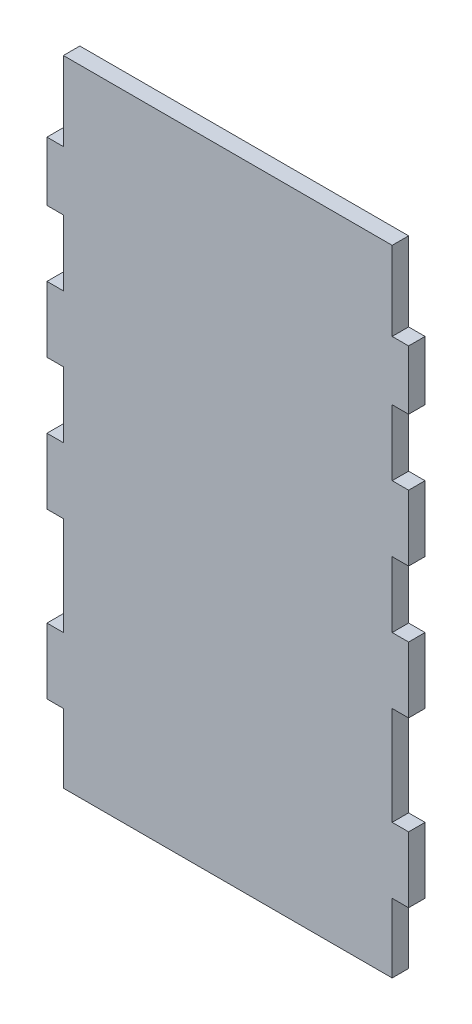
ISO-10303-21;
HEADER;
FILE_DESCRIPTION(('STEP AP214'),'2;1');
FILE_NAME('part.step','',(''),(''),'','','');
FILE_SCHEMA(('AUTOMOTIVE_DESIGN { 1 0 10303 214 1 1 1 1 }'));
ENDSEC;
DATA;
#1=APPLICATION_CONTEXT('core data for automotive mechanical design processes');
#2=APPLICATION_PROTOCOL_DEFINITION('international standard','automotive_design',2000,#1);
#3=PRODUCT_CONTEXT('',#1,'mechanical');
#4=PRODUCT('Part','Part','',(#3));
#5=PRODUCT_RELATED_PRODUCT_CATEGORY('part','',(#4));
#6=PRODUCT_DEFINITION_FORMATION('','',#4);
#7=PRODUCT_DEFINITION_CONTEXT('part definition',#1,'design');
#8=PRODUCT_DEFINITION('design','',#6,#7);
#9=PRODUCT_DEFINITION_SHAPE('','',#8);
#10=(LENGTH_UNIT() NAMED_UNIT(*) SI_UNIT(.MILLI.,.METRE.));
#11=(NAMED_UNIT(*) PLANE_ANGLE_UNIT() SI_UNIT($,.RADIAN.));
#12=(NAMED_UNIT(*) SI_UNIT($,.STERADIAN.) SOLID_ANGLE_UNIT());
#13=UNCERTAINTY_MEASURE_WITH_UNIT(LENGTH_MEASURE(1.E-05),#10,'distance_accuracy_value','');
#14=(GEOMETRIC_REPRESENTATION_CONTEXT(3) GLOBAL_UNCERTAINTY_ASSIGNED_CONTEXT((#13)) GLOBAL_UNIT_ASSIGNED_CONTEXT((#10,
#11,#12)) REPRESENTATION_CONTEXT('',''));
#15=CARTESIAN_POINT('',(0.,0.,0.));
#16=DIRECTION('',(0.,0.,1.));
#17=DIRECTION('',(1.,0.,0.));
#18=AXIS2_PLACEMENT_3D('',#15,#16,#17);
#19=CARTESIAN_POINT('',(-133.35,6.34999999999993,6.35));
#20=DIRECTION('',(1.,0.,0.));
#21=DIRECTION('',(0.,0.,-1.));
#22=AXIS2_PLACEMENT_3D('',#19,#20,#21);
#23=PLANE('',#22);
#24=DIRECTION('',(0.,-1.,0.));
#25=VECTOR('',#24,1.);
#26=CARTESIAN_POINT('',(-133.35,6.34999999999993,0.));
#27=LINE('',#26,#25);
#28=CARTESIAN_POINT('',(-133.35,58.42,0.));
#29=VERTEX_POINT('',#28);
#30=CARTESIAN_POINT('',(-133.35,33.02,0.));
#31=VERTEX_POINT('',#30);
#32=EDGE_CURVE('E312',#29,#31,#27,.T.);
#33=ORIENTED_EDGE('',*,*,#32,.T.);
#34=DIRECTION('',(0.,0.,-1.));
#35=VECTOR('',#34,1.);
#36=CARTESIAN_POINT('',(-133.35,33.02,6.35));
#37=LINE('',#36,#35);
#38=CARTESIAN_POINT('',(-133.35,33.02,6.35));
#39=VERTEX_POINT('',#38);
#40=EDGE_CURVE('E948',#39,#31,#37,.T.);
#41=ORIENTED_EDGE('',*,*,#40,.F.);
#42=DIRECTION('',(0.,-1.,0.));
#43=VECTOR('',#42,1.);
#44=CARTESIAN_POINT('',(-133.35,6.34999999999993,6.35));
#45=LINE('',#44,#43);
#46=CARTESIAN_POINT('',(-133.35,58.42,6.35));
#47=VERTEX_POINT('',#46);
#48=EDGE_CURVE('E300',#47,#39,#45,.T.);
#49=ORIENTED_EDGE('',*,*,#48,.F.);
#50=DIRECTION('',(0.,0.,-1.));
#51=VECTOR('',#50,1.);
#52=CARTESIAN_POINT('',(-133.35,58.42,6.35));
#53=LINE('',#52,#51);
#54=EDGE_CURVE('E366',#47,#29,#53,.T.);
#55=ORIENTED_EDGE('',*,*,#54,.T.);
#56=EDGE_LOOP('',(#33,#41,#49,#55));
#57=FACE_BOUND('',#56,.T.);
#58=ADVANCED_FACE('F37',(#57),#23,.F.);
#59=CARTESIAN_POINT('',(-133.35,121.92,0.));
#60=VERTEX_POINT('',#59);
#61=CARTESIAN_POINT('',(-133.35,96.52,0.));
#62=VERTEX_POINT('',#61);
#63=EDGE_CURVE('E314',#60,#62,#27,.T.);
#64=ORIENTED_EDGE('',*,*,#63,.T.);
#65=DIRECTION('',(0.,0.,-1.));
#66=VECTOR('',#65,1.);
#67=CARTESIAN_POINT('',(-133.35,96.52,6.35));
#68=LINE('',#67,#66);
#69=CARTESIAN_POINT('',(-133.35,96.52,6.35));
#70=VERTEX_POINT('',#69);
#71=EDGE_CURVE('E339',#70,#62,#68,.T.);
#72=ORIENTED_EDGE('',*,*,#71,.F.);
#73=CARTESIAN_POINT('',(-133.35,121.92,6.35));
#74=VERTEX_POINT('',#73);
#75=EDGE_CURVE('E303',#74,#70,#45,.T.);
#76=ORIENTED_EDGE('',*,*,#75,.F.);
#77=DIRECTION('',(0.,0.,-1.));
#78=VECTOR('',#77,1.);
#79=CARTESIAN_POINT('',(-133.35,121.92,6.35));
#80=LINE('',#79,#78);
#81=EDGE_CURVE('E341',#74,#60,#80,.T.);
#82=ORIENTED_EDGE('',*,*,#81,.T.);
#83=EDGE_LOOP('',(#64,#72,#76,#82));
#84=FACE_BOUND('',#83,.T.);
#85=ADVANCED_FACE('F337',(#84),#23,.F.);
#86=CARTESIAN_POINT('',(-133.35,172.72,0.));
#87=VERTEX_POINT('',#86);
#88=CARTESIAN_POINT('',(-133.35,147.32,0.));
#89=VERTEX_POINT('',#88);
#90=EDGE_CURVE('E322',#87,#89,#27,.T.);
#91=ORIENTED_EDGE('',*,*,#90,.T.);
#92=DIRECTION('',(0.,0.,-1.));
#93=VECTOR('',#92,1.);
#94=CARTESIAN_POINT('',(-133.35,147.32,6.35));
#95=LINE('',#94,#93);
#96=CARTESIAN_POINT('',(-133.35,147.32,6.35));
#97=VERTEX_POINT('',#96);
#98=EDGE_CURVE('E384',#97,#89,#95,.T.);
#99=ORIENTED_EDGE('',*,*,#98,.F.);
#100=CARTESIAN_POINT('',(-133.35,172.72,6.35));
#101=VERTEX_POINT('',#100);
#102=EDGE_CURVE('E931',#101,#97,#45,.T.);
#103=ORIENTED_EDGE('',*,*,#102,.F.);
#104=DIRECTION('',(0.,0.,-1.));
#105=VECTOR('',#104,1.);
#106=CARTESIAN_POINT('',(-133.35,172.72,6.35));
#107=LINE('',#106,#105);
#108=EDGE_CURVE('E389',#101,#87,#107,.T.);
#109=ORIENTED_EDGE('',*,*,#108,.T.);
#110=EDGE_LOOP('',(#91,#99,#103,#109));
#111=FACE_BOUND('',#110,.T.);
#112=ADVANCED_FACE('F616',(#111),#23,.F.);
#113=CARTESIAN_POINT('',(0.,0.,6.35));
#114=DIRECTION('',(0.,0.,1.));
#115=DIRECTION('',(1.,0.,0.));
#116=AXIS2_PLACEMENT_3D('',#113,#114,#115);
#117=PLANE('',#116);
#118=DIRECTION('',(1.,0.,0.));
#119=VECTOR('',#118,1.);
#120=CARTESIAN_POINT('',(-133.35,251.46,6.35));
#121=LINE('',#120,#119);
#122=CARTESIAN_POINT('',(-127.,251.46,6.35));
#123=VERTEX_POINT('',#122);
#124=CARTESIAN_POINT('',(0.,251.46,6.35));
#125=VERTEX_POINT('',#124);
#126=EDGE_CURVE('E267',#123,#125,#121,.T.);
#127=ORIENTED_EDGE('',*,*,#126,.F.);
#128=DIRECTION('',(0.,1.,0.));
#129=VECTOR('',#128,1.);
#130=CARTESIAN_POINT('',(-127.,0.,6.35));
#131=LINE('',#130,#129);
#132=CARTESIAN_POINT('',(-127.,220.98,6.35));
#133=VERTEX_POINT('',#132);
#134=EDGE_CURVE('E422',#133,#123,#131,.T.);
#135=ORIENTED_EDGE('',*,*,#134,.F.);
#136=DIRECTION('',(-1.,0.,0.));
#137=VECTOR('',#136,1.);
#138=CARTESIAN_POINT('',(0.,220.98,6.35));
#139=LINE('',#138,#137);
#140=CARTESIAN_POINT('',(-133.35,220.98,6.35));
#141=VERTEX_POINT('',#140);
#142=EDGE_CURVE('E424',#133,#141,#139,.T.);
#143=ORIENTED_EDGE('',*,*,#142,.T.);
#144=CARTESIAN_POINT('',(-133.35,198.12,6.35));
#145=VERTEX_POINT('',#144);
#146=EDGE_CURVE('E304',#141,#145,#45,.T.);
#147=ORIENTED_EDGE('',*,*,#146,.T.);
#148=DIRECTION('',(1.,0.,0.));
#149=VECTOR('',#148,1.);
#150=CARTESIAN_POINT('',(0.,198.12,6.35));
#151=LINE('',#150,#149);
#152=CARTESIAN_POINT('',(-127.,198.12,6.35));
#153=VERTEX_POINT('',#152);
#154=EDGE_CURVE('E397',#145,#153,#151,.T.);
#155=ORIENTED_EDGE('',*,*,#154,.T.);
#156=DIRECTION('',(0.,-1.,0.));
#157=VECTOR('',#156,1.);
#158=CARTESIAN_POINT('',(-127.,0.,6.35));
#159=LINE('',#158,#157);
#160=CARTESIAN_POINT('',(-127.,172.72,6.35));
#161=VERTEX_POINT('',#160);
#162=EDGE_CURVE('E400',#153,#161,#159,.T.);
#163=ORIENTED_EDGE('',*,*,#162,.T.);
#164=DIRECTION('',(-1.,0.,0.));
#165=VECTOR('',#164,1.);
#166=CARTESIAN_POINT('',(0.,172.72,6.35));
#167=LINE('',#166,#165);
#168=EDGE_CURVE('E404',#161,#101,#167,.T.);
#169=ORIENTED_EDGE('',*,*,#168,.T.);
#170=ORIENTED_EDGE('',*,*,#102,.T.);
#171=DIRECTION('',(1.,0.,0.));
#172=VECTOR('',#171,1.);
#173=CARTESIAN_POINT('',(0.,147.32,6.35));
#174=LINE('',#173,#172);
#175=CARTESIAN_POINT('',(-127.,147.32,6.35));
#176=VERTEX_POINT('',#175);
#177=EDGE_CURVE('E375',#97,#176,#174,.T.);
#178=ORIENTED_EDGE('',*,*,#177,.T.);
#179=DIRECTION('',(0.,-1.,0.));
#180=VECTOR('',#179,1.);
#181=CARTESIAN_POINT('',(-127.,0.,6.35));
#182=LINE('',#181,#180);
#183=CARTESIAN_POINT('',(-127.,121.92,6.35));
#184=VERTEX_POINT('',#183);
#185=EDGE_CURVE('E378',#176,#184,#182,.T.);
#186=ORIENTED_EDGE('',*,*,#185,.T.);
#187=DIRECTION('',(-1.,0.,0.));
#188=VECTOR('',#187,1.);
#189=CARTESIAN_POINT('',(0.,121.92,6.35));
#190=LINE('',#189,#188);
#191=EDGE_CURVE('E381',#184,#74,#190,.T.);
#192=ORIENTED_EDGE('',*,*,#191,.T.);
#193=ORIENTED_EDGE('',*,*,#75,.T.);
#194=DIRECTION('',(1.,0.,0.));
#195=VECTOR('',#194,1.);
#196=CARTESIAN_POINT('',(0.,96.52,6.35));
#197=LINE('',#196,#195);
#198=CARTESIAN_POINT('',(-127.,96.52,6.35));
#199=VERTEX_POINT('',#198);
#200=EDGE_CURVE('E365',#70,#199,#197,.T.);
#201=ORIENTED_EDGE('',*,*,#200,.T.);
#202=DIRECTION('',(0.,-1.,0.));
#203=VECTOR('',#202,1.);
#204=CARTESIAN_POINT('',(-127.,0.,6.35));
#205=LINE('',#204,#203);
#206=CARTESIAN_POINT('',(-127.,58.42,6.35));
#207=VERTEX_POINT('',#206);
#208=EDGE_CURVE('E945',#199,#207,#205,.T.);
#209=ORIENTED_EDGE('',*,*,#208,.T.);
#210=DIRECTION('',(-1.,0.,0.));
#211=VECTOR('',#210,1.);
#212=CARTESIAN_POINT('',(0.,58.42,6.35));
#213=LINE('',#212,#211);
#214=EDGE_CURVE('E361',#207,#47,#213,.T.);
#215=ORIENTED_EDGE('',*,*,#214,.T.);
#216=ORIENTED_EDGE('',*,*,#48,.T.);
#217=DIRECTION('',(1.,0.,0.));
#218=VECTOR('',#217,1.);
#219=CARTESIAN_POINT('',(0.,33.02,6.35));
#220=LINE('',#219,#218);
#221=CARTESIAN_POINT('',(-127.,33.02,6.35));
#222=VERTEX_POINT('',#221);
#223=EDGE_CURVE('E956',#39,#222,#220,.T.);
#224=ORIENTED_EDGE('',*,*,#223,.T.);
#225=DIRECTION('',(0.,-1.,0.));
#226=VECTOR('',#225,1.);
#227=CARTESIAN_POINT('',(-127.,0.,6.35));
#228=LINE('',#227,#226);
#229=CARTESIAN_POINT('',(-127.,6.34999999999993,6.35));
#230=VERTEX_POINT('',#229);
#231=EDGE_CURVE('E951',#222,#230,#228,.T.);
#232=ORIENTED_EDGE('',*,*,#231,.T.);
#233=DIRECTION('',(1.,0.,0.));
#234=VECTOR('',#233,1.);
#235=CARTESIAN_POINT('',(6.35,6.34999999999995,6.35));
#236=LINE('',#235,#234);
#237=CARTESIAN_POINT('',(0.,6.34999999999995,6.35));
#238=VERTEX_POINT('',#237);
#239=EDGE_CURVE('E45',#230,#238,#236,.T.);
#240=ORIENTED_EDGE('',*,*,#239,.T.);
#241=DIRECTION('',(0.,-1.,0.));
#242=VECTOR('',#241,1.);
#243=CARTESIAN_POINT('',(0.,6.34999999999995,6.35));
#244=LINE('',#243,#242);
#245=CARTESIAN_POINT('',(0.,33.02,6.35));
#246=VERTEX_POINT('',#245);
#247=EDGE_CURVE('E433',#246,#238,#244,.T.);
#248=ORIENTED_EDGE('',*,*,#247,.F.);
#249=DIRECTION('',(1.,0.,0.));
#250=VECTOR('',#249,1.);
#251=CARTESIAN_POINT('',(0.,33.02,6.35));
#252=LINE('',#251,#250);
#253=CARTESIAN_POINT('',(6.35,33.02,6.35));
#254=VERTEX_POINT('',#253);
#255=EDGE_CURVE('E310',#246,#254,#252,.T.);
#256=ORIENTED_EDGE('',*,*,#255,.T.);
#257=DIRECTION('',(0.,1.,0.));
#258=VECTOR('',#257,1.);
#259=CARTESIAN_POINT('',(6.35,6.34999999999995,6.35));
#260=LINE('',#259,#258);
#261=CARTESIAN_POINT('',(6.35,58.42,6.35));
#262=VERTEX_POINT('',#261);
#263=EDGE_CURVE('E299',#254,#262,#260,.T.);
#264=ORIENTED_EDGE('',*,*,#263,.T.);
#265=DIRECTION('',(1.,0.,0.));
#266=VECTOR('',#265,1.);
#267=CARTESIAN_POINT('',(0.,58.42,6.35));
#268=LINE('',#267,#266);
#269=CARTESIAN_POINT('',(0.,58.42,6.35));
#270=VERTEX_POINT('',#269);
#271=EDGE_CURVE('E450',#270,#262,#268,.T.);
#272=ORIENTED_EDGE('',*,*,#271,.F.);
#273=DIRECTION('',(0.,-1.,0.));
#274=VECTOR('',#273,1.);
#275=CARTESIAN_POINT('',(0.,58.42,6.35));
#276=LINE('',#275,#274);
#277=CARTESIAN_POINT('',(0.,96.52,6.35));
#278=VERTEX_POINT('',#277);
#279=EDGE_CURVE('E464',#278,#270,#276,.T.);
#280=ORIENTED_EDGE('',*,*,#279,.F.);
#281=DIRECTION('',(1.,0.,0.));
#282=VECTOR('',#281,1.);
#283=CARTESIAN_POINT('',(0.,96.52,6.35));
#284=LINE('',#283,#282);
#285=CARTESIAN_POINT('',(6.35,96.52,6.35));
#286=VERTEX_POINT('',#285);
#287=EDGE_CURVE('E458',#278,#286,#284,.T.);
#288=ORIENTED_EDGE('',*,*,#287,.T.);
#289=CARTESIAN_POINT('',(6.35,121.92,6.35));
#290=VERTEX_POINT('',#289);
#291=EDGE_CURVE('E577',#286,#290,#260,.T.);
#292=ORIENTED_EDGE('',*,*,#291,.T.);
#293=DIRECTION('',(1.,0.,0.));
#294=VECTOR('',#293,1.);
#295=CARTESIAN_POINT('',(0.,121.92,6.35));
#296=LINE('',#295,#294);
#297=CARTESIAN_POINT('',(0.,121.92,6.35));
#298=VERTEX_POINT('',#297);
#299=EDGE_CURVE('E474',#298,#290,#296,.T.);
#300=ORIENTED_EDGE('',*,*,#299,.F.);
#301=DIRECTION('',(0.,-1.,0.));
#302=VECTOR('',#301,1.);
#303=CARTESIAN_POINT('',(0.,121.92,6.35));
#304=LINE('',#303,#302);
#305=CARTESIAN_POINT('',(0.,147.32,6.35));
#306=VERTEX_POINT('',#305);
#307=EDGE_CURVE('E488',#306,#298,#304,.T.);
#308=ORIENTED_EDGE('',*,*,#307,.F.);
#309=DIRECTION('',(1.,0.,0.));
#310=VECTOR('',#309,1.);
#311=CARTESIAN_POINT('',(0.,147.32,6.35));
#312=LINE('',#311,#310);
#313=CARTESIAN_POINT('',(6.35,147.32,6.35));
#314=VERTEX_POINT('',#313);
#315=EDGE_CURVE('E482',#306,#314,#312,.T.);
#316=ORIENTED_EDGE('',*,*,#315,.T.);
#317=CARTESIAN_POINT('',(6.35,172.72,6.35));
#318=VERTEX_POINT('',#317);
#319=EDGE_CURVE('E297',#314,#318,#260,.T.);
#320=ORIENTED_EDGE('',*,*,#319,.T.);
#321=DIRECTION('',(1.,0.,0.));
#322=VECTOR('',#321,1.);
#323=CARTESIAN_POINT('',(0.,172.72,6.35));
#324=LINE('',#323,#322);
#325=CARTESIAN_POINT('',(0.,172.72,6.35));
#326=VERTEX_POINT('',#325);
#327=EDGE_CURVE('E498',#326,#318,#324,.T.);
#328=ORIENTED_EDGE('',*,*,#327,.F.);
#329=DIRECTION('',(0.,-1.,0.));
#330=VECTOR('',#329,1.);
#331=CARTESIAN_POINT('',(0.,172.72,6.35));
#332=LINE('',#331,#330);
#333=CARTESIAN_POINT('',(0.,198.12,6.35));
#334=VERTEX_POINT('',#333);
#335=EDGE_CURVE('E511',#334,#326,#332,.T.);
#336=ORIENTED_EDGE('',*,*,#335,.F.);
#337=DIRECTION('',(1.,0.,0.));
#338=VECTOR('',#337,1.);
#339=CARTESIAN_POINT('',(0.,198.12,6.35));
#340=LINE('',#339,#338);
#341=CARTESIAN_POINT('',(6.35,198.12,6.35));
#342=VERTEX_POINT('',#341);
#343=EDGE_CURVE('E506',#334,#342,#340,.T.);
#344=ORIENTED_EDGE('',*,*,#343,.T.);
#345=CARTESIAN_POINT('',(6.35,220.98,6.35));
#346=VERTEX_POINT('',#345);
#347=EDGE_CURVE('E295',#342,#346,#260,.T.);
#348=ORIENTED_EDGE('',*,*,#347,.T.);
#349=DIRECTION('',(1.,0.,0.));
#350=VECTOR('',#349,1.);
#351=CARTESIAN_POINT('',(0.,220.98,6.35));
#352=LINE('',#351,#350);
#353=CARTESIAN_POINT('',(0.,220.98,6.35));
#354=VERTEX_POINT('',#353);
#355=EDGE_CURVE('E287',#354,#346,#352,.T.);
#356=ORIENTED_EDGE('',*,*,#355,.F.);
#357=DIRECTION('',(0.,-1.,0.));
#358=VECTOR('',#357,1.);
#359=CARTESIAN_POINT('',(0.,220.98,6.35));
#360=LINE('',#359,#358);
#361=EDGE_CURVE('E279',#125,#354,#360,.T.);
#362=ORIENTED_EDGE('',*,*,#361,.F.);
#363=EDGE_LOOP('',(#127,#135,#143,#147,#155,#163,#169,#170,#178,#186,#192,#193,#201,#209,#215,
#216,#224,#232,#240,#248,#256,#264,#272,#280,#288,#292,#300,#308,#316,#320,#328,#336,#344,#348,
#356,#362));
#364=FACE_BOUND('',#363,.T.);
#365=ADVANCED_FACE('F285',(#364),#117,.T.);
#366=CARTESIAN_POINT('',(0.,0.,0.));
#367=DIRECTION('',(0.,0.,1.));
#368=DIRECTION('',(1.,0.,0.));
#369=AXIS2_PLACEMENT_3D('',#366,#367,#368);
#370=PLANE('',#369);
#371=DIRECTION('',(0.,1.,0.));
#372=VECTOR('',#371,1.);
#373=CARTESIAN_POINT('',(-127.,0.,0.));
#374=LINE('',#373,#372);
#375=CARTESIAN_POINT('',(-127.,220.98,0.));
#376=VERTEX_POINT('',#375);
#377=CARTESIAN_POINT('',(-127.,251.46,0.));
#378=VERTEX_POINT('',#377);
#379=EDGE_CURVE('E58',#376,#378,#374,.T.);
#380=ORIENTED_EDGE('',*,*,#379,.T.);
#381=DIRECTION('',(1.,0.,0.));
#382=VECTOR('',#381,1.);
#383=CARTESIAN_POINT('',(-133.35,251.46,0.));
#384=LINE('',#383,#382);
#385=CARTESIAN_POINT('',(0.,251.46,0.));
#386=VERTEX_POINT('',#385);
#387=EDGE_CURVE('E51',#378,#386,#384,.T.);
#388=ORIENTED_EDGE('',*,*,#387,.T.);
#389=DIRECTION('',(0.,1.,0.));
#390=VECTOR('',#389,1.);
#391=CARTESIAN_POINT('',(0.,220.98,0.));
#392=LINE('',#391,#390);
#393=CARTESIAN_POINT('',(0.,220.98,0.));
#394=VERTEX_POINT('',#393);
#395=EDGE_CURVE('E282',#394,#386,#392,.T.);
#396=ORIENTED_EDGE('',*,*,#395,.F.);
#397=DIRECTION('',(1.,0.,0.));
#398=VECTOR('',#397,1.);
#399=CARTESIAN_POINT('',(0.,220.98,0.));
#400=LINE('',#399,#398);
#401=CARTESIAN_POINT('',(6.35,220.98,0.));
#402=VERTEX_POINT('',#401);
#403=EDGE_CURVE('E522',#394,#402,#400,.T.);
#404=ORIENTED_EDGE('',*,*,#403,.T.);
#405=DIRECTION('',(0.,1.,0.));
#406=VECTOR('',#405,1.);
#407=CARTESIAN_POINT('',(6.35,6.34999999999995,0.));
#408=LINE('',#407,#406);
#409=CARTESIAN_POINT('',(6.35,198.12,0.));
#410=VERTEX_POINT('',#409);
#411=EDGE_CURVE('E306',#410,#402,#408,.T.);
#412=ORIENTED_EDGE('',*,*,#411,.F.);
#413=DIRECTION('',(1.,0.,0.));
#414=VECTOR('',#413,1.);
#415=CARTESIAN_POINT('',(0.,198.12,0.));
#416=LINE('',#415,#414);
#417=CARTESIAN_POINT('',(0.,198.12,0.));
#418=VERTEX_POINT('',#417);
#419=EDGE_CURVE('E504',#418,#410,#416,.T.);
#420=ORIENTED_EDGE('',*,*,#419,.F.);
#421=DIRECTION('',(0.,1.,0.));
#422=VECTOR('',#421,1.);
#423=CARTESIAN_POINT('',(0.,172.72,0.));
#424=LINE('',#423,#422);
#425=CARTESIAN_POINT('',(0.,172.72,0.));
#426=VERTEX_POINT('',#425);
#427=EDGE_CURVE('E515',#426,#418,#424,.T.);
#428=ORIENTED_EDGE('',*,*,#427,.F.);
#429=DIRECTION('',(1.,0.,0.));
#430=VECTOR('',#429,1.);
#431=CARTESIAN_POINT('',(0.,172.72,0.));
#432=LINE('',#431,#430);
#433=CARTESIAN_POINT('',(6.35,172.72,0.));
#434=VERTEX_POINT('',#433);
#435=EDGE_CURVE('E501',#426,#434,#432,.T.);
#436=ORIENTED_EDGE('',*,*,#435,.T.);
#437=CARTESIAN_POINT('',(6.35,147.32,0.));
#438=VERTEX_POINT('',#437);
#439=EDGE_CURVE('E309',#438,#434,#408,.T.);
#440=ORIENTED_EDGE('',*,*,#439,.F.);
#441=DIRECTION('',(1.,0.,0.));
#442=VECTOR('',#441,1.);
#443=CARTESIAN_POINT('',(0.,147.32,0.));
#444=LINE('',#443,#442);
#445=CARTESIAN_POINT('',(0.,147.32,0.));
#446=VERTEX_POINT('',#445);
#447=EDGE_CURVE('E480',#446,#438,#444,.T.);
#448=ORIENTED_EDGE('',*,*,#447,.F.);
#449=DIRECTION('',(0.,1.,0.));
#450=VECTOR('',#449,1.);
#451=CARTESIAN_POINT('',(0.,121.92,0.));
#452=LINE('',#451,#450);
#453=CARTESIAN_POINT('',(0.,121.92,0.));
#454=VERTEX_POINT('',#453);
#455=EDGE_CURVE('E492',#454,#446,#452,.T.);
#456=ORIENTED_EDGE('',*,*,#455,.F.);
#457=DIRECTION('',(1.,0.,0.));
#458=VECTOR('',#457,1.);
#459=CARTESIAN_POINT('',(0.,121.92,0.));
#460=LINE('',#459,#458);
#461=CARTESIAN_POINT('',(6.35,121.92,0.));
#462=VERTEX_POINT('',#461);
#463=EDGE_CURVE('E477',#454,#462,#460,.T.);
#464=ORIENTED_EDGE('',*,*,#463,.T.);
#465=CARTESIAN_POINT('',(6.35,96.52,0.));
#466=VERTEX_POINT('',#465);
#467=EDGE_CURVE('E554',#466,#462,#408,.T.);
#468=ORIENTED_EDGE('',*,*,#467,.F.);
#469=DIRECTION('',(1.,0.,0.));
#470=VECTOR('',#469,1.);
#471=CARTESIAN_POINT('',(0.,96.52,0.));
#472=LINE('',#471,#470);
#473=CARTESIAN_POINT('',(0.,96.52,0.));
#474=VERTEX_POINT('',#473);
#475=EDGE_CURVE('E456',#474,#466,#472,.T.);
#476=ORIENTED_EDGE('',*,*,#475,.F.);
#477=DIRECTION('',(0.,1.,0.));
#478=VECTOR('',#477,1.);
#479=CARTESIAN_POINT('',(0.,58.42,0.));
#480=LINE('',#479,#478);
#481=CARTESIAN_POINT('',(0.,58.42,0.));
#482=VERTEX_POINT('',#481);
#483=EDGE_CURVE('E468',#482,#474,#480,.T.);
#484=ORIENTED_EDGE('',*,*,#483,.F.);
#485=DIRECTION('',(1.,0.,0.));
#486=VECTOR('',#485,1.);
#487=CARTESIAN_POINT('',(0.,58.42,0.));
#488=LINE('',#487,#486);
#489=CARTESIAN_POINT('',(6.35,58.42,0.));
#490=VERTEX_POINT('',#489);
#491=EDGE_CURVE('E453',#482,#490,#488,.T.);
#492=ORIENTED_EDGE('',*,*,#491,.T.);
#493=CARTESIAN_POINT('',(6.35,33.02,0.));
#494=VERTEX_POINT('',#493);
#495=EDGE_CURVE('E311',#494,#490,#408,.T.);
#496=ORIENTED_EDGE('',*,*,#495,.F.);
#497=DIRECTION('',(1.,0.,0.));
#498=VECTOR('',#497,1.);
#499=CARTESIAN_POINT('',(0.,33.02,0.));
#500=LINE('',#499,#498);
#501=CARTESIAN_POINT('',(0.,33.02,0.));
#502=VERTEX_POINT('',#501);
#503=EDGE_CURVE('E444',#502,#494,#500,.T.);
#504=ORIENTED_EDGE('',*,*,#503,.F.);
#505=DIRECTION('',(0.,1.,0.));
#506=VECTOR('',#505,1.);
#507=CARTESIAN_POINT('',(0.,6.34999999999995,0.));
#508=LINE('',#507,#506);
#509=CARTESIAN_POINT('',(0.,6.34999999999995,0.));
#510=VERTEX_POINT('',#509);
#511=EDGE_CURVE('E439',#510,#502,#508,.T.);
#512=ORIENTED_EDGE('',*,*,#511,.F.);
#513=DIRECTION('',(1.,0.,0.));
#514=VECTOR('',#513,1.);
#515=CARTESIAN_POINT('',(6.35,6.34999999999995,0.));
#516=LINE('',#515,#514);
#517=CARTESIAN_POINT('',(-127.,6.34999999999993,0.));
#518=VERTEX_POINT('',#517);
#519=EDGE_CURVE('E298',#518,#510,#516,.T.);
#520=ORIENTED_EDGE('',*,*,#519,.F.);
#521=DIRECTION('',(0.,-1.,0.));
#522=VECTOR('',#521,1.);
#523=CARTESIAN_POINT('',(-127.,0.,0.));
#524=LINE('',#523,#522);
#525=CARTESIAN_POINT('',(-127.,33.02,0.));
#526=VERTEX_POINT('',#525);
#527=EDGE_CURVE('E954',#526,#518,#524,.T.);
#528=ORIENTED_EDGE('',*,*,#527,.F.);
#529=DIRECTION('',(1.,0.,0.));
#530=VECTOR('',#529,1.);
#531=CARTESIAN_POINT('',(0.,33.02,0.));
#532=LINE('',#531,#530);
#533=EDGE_CURVE('E369',#31,#526,#532,.T.);
#534=ORIENTED_EDGE('',*,*,#533,.F.);
#535=ORIENTED_EDGE('',*,*,#32,.F.);
#536=DIRECTION('',(-1.,0.,0.));
#537=VECTOR('',#536,1.);
#538=CARTESIAN_POINT('',(0.,58.42,0.));
#539=LINE('',#538,#537);
#540=CARTESIAN_POINT('',(-127.,58.42,0.));
#541=VERTEX_POINT('',#540);
#542=EDGE_CURVE('E356',#541,#29,#539,.T.);
#543=ORIENTED_EDGE('',*,*,#542,.F.);
#544=DIRECTION('',(0.,-1.,0.));
#545=VECTOR('',#544,1.);
#546=CARTESIAN_POINT('',(-127.,0.,0.));
#547=LINE('',#546,#545);
#548=CARTESIAN_POINT('',(-127.,96.52,0.));
#549=VERTEX_POINT('',#548);
#550=EDGE_CURVE('E353',#549,#541,#547,.T.);
#551=ORIENTED_EDGE('',*,*,#550,.F.);
#552=DIRECTION('',(1.,0.,0.));
#553=VECTOR('',#552,1.);
#554=CARTESIAN_POINT('',(0.,96.52,0.));
#555=LINE('',#554,#553);
#556=EDGE_CURVE('E350',#62,#549,#555,.T.);
#557=ORIENTED_EDGE('',*,*,#556,.F.);
#558=ORIENTED_EDGE('',*,*,#63,.F.);
#559=DIRECTION('',(-1.,0.,0.));
#560=VECTOR('',#559,1.);
#561=CARTESIAN_POINT('',(0.,121.92,0.));
#562=LINE('',#561,#560);
#563=CARTESIAN_POINT('',(-127.,121.92,0.));
#564=VERTEX_POINT('',#563);
#565=EDGE_CURVE('E347',#564,#60,#562,.T.);
#566=ORIENTED_EDGE('',*,*,#565,.F.);
#567=DIRECTION('',(0.,-1.,0.));
#568=VECTOR('',#567,1.);
#569=CARTESIAN_POINT('',(-127.,0.,0.));
#570=LINE('',#569,#568);
#571=CARTESIAN_POINT('',(-127.,147.32,0.));
#572=VERTEX_POINT('',#571);
#573=EDGE_CURVE('E388',#572,#564,#570,.T.);
#574=ORIENTED_EDGE('',*,*,#573,.F.);
#575=DIRECTION('',(1.,0.,0.));
#576=VECTOR('',#575,1.);
#577=CARTESIAN_POINT('',(0.,147.32,0.));
#578=LINE('',#577,#576);
#579=EDGE_CURVE('E385',#89,#572,#578,.T.);
#580=ORIENTED_EDGE('',*,*,#579,.F.);
#581=ORIENTED_EDGE('',*,*,#90,.F.);
#582=DIRECTION('',(-1.,0.,0.));
#583=VECTOR('',#582,1.);
#584=CARTESIAN_POINT('',(0.,172.72,0.));
#585=LINE('',#584,#583);
#586=CARTESIAN_POINT('',(-127.,172.72,0.));
#587=VERTEX_POINT('',#586);
#588=EDGE_CURVE('E401',#587,#87,#585,.T.);
#589=ORIENTED_EDGE('',*,*,#588,.F.);
#590=DIRECTION('',(0.,-1.,0.));
#591=VECTOR('',#590,1.);
#592=CARTESIAN_POINT('',(-127.,0.,0.));
#593=LINE('',#592,#591);
#594=CARTESIAN_POINT('',(-127.,198.12,0.));
#595=VERTEX_POINT('',#594);
#596=EDGE_CURVE('E411',#595,#587,#593,.T.);
#597=ORIENTED_EDGE('',*,*,#596,.F.);
#598=DIRECTION('',(1.,0.,0.));
#599=VECTOR('',#598,1.);
#600=CARTESIAN_POINT('',(0.,198.12,0.));
#601=LINE('',#600,#599);
#602=CARTESIAN_POINT('',(-133.35,198.12,0.));
#603=VERTEX_POINT('',#602);
#604=EDGE_CURVE('E408',#603,#595,#601,.T.);
#605=ORIENTED_EDGE('',*,*,#604,.F.);
#606=CARTESIAN_POINT('',(-133.35,220.98,0.));
#607=VERTEX_POINT('',#606);
#608=EDGE_CURVE('E315',#607,#603,#27,.T.);
#609=ORIENTED_EDGE('',*,*,#608,.F.);
#610=DIRECTION('',(-1.,0.,0.));
#611=VECTOR('',#610,1.);
#612=CARTESIAN_POINT('',(0.,220.98,0.));
#613=LINE('',#612,#611);
#614=EDGE_CURVE('E425',#376,#607,#613,.T.);
#615=ORIENTED_EDGE('',*,*,#614,.F.);
#616=EDGE_LOOP('',(#380,#388,#396,#404,#412,#420,#428,#436,#440,#448,#456,#464,#468,#476,#484,
#492,#496,#504,#512,#520,#528,#534,#535,#543,#551,#557,#558,#566,#574,#580,#581,#589,#597,#605,
#609,#615));
#617=FACE_BOUND('',#616,.T.);
#618=ADVANCED_FACE('F345',(#617),#370,.F.);
#619=CARTESIAN_POINT('',(6.35,6.34999999999995,6.35));
#620=DIRECTION('',(-1.,0.,0.));
#621=DIRECTION('',(0.,0.,1.));
#622=AXIS2_PLACEMENT_3D('',#619,#620,#621);
#623=PLANE('',#622);
#624=ORIENTED_EDGE('',*,*,#291,.F.);
#625=DIRECTION('',(0.,0.,1.));
#626=VECTOR('',#625,1.);
#627=CARTESIAN_POINT('',(6.35,96.52,6.35));
#628=LINE('',#627,#626);
#629=EDGE_CURVE('E462',#466,#286,#628,.T.);
#630=ORIENTED_EDGE('',*,*,#629,.F.);
#631=ORIENTED_EDGE('',*,*,#467,.T.);
#632=DIRECTION('',(0.,0.,-1.));
#633=VECTOR('',#632,1.);
#634=CARTESIAN_POINT('',(6.35,121.92,6.35));
#635=LINE('',#634,#633);
#636=EDGE_CURVE('E461',#290,#462,#635,.T.);
#637=ORIENTED_EDGE('',*,*,#636,.F.);
#638=EDGE_LOOP('',(#624,#630,#631,#637));
#639=FACE_BOUND('',#638,.T.);
#640=ADVANCED_FACE('F591',(#639),#623,.F.);
#641=ORIENTED_EDGE('',*,*,#319,.F.);
#642=DIRECTION('',(0.,0.,1.));
#643=VECTOR('',#642,1.);
#644=CARTESIAN_POINT('',(6.35,147.32,6.35));
#645=LINE('',#644,#643);
#646=EDGE_CURVE('E486',#438,#314,#645,.T.);
#647=ORIENTED_EDGE('',*,*,#646,.F.);
#648=ORIENTED_EDGE('',*,*,#439,.T.);
#649=DIRECTION('',(0.,0.,-1.));
#650=VECTOR('',#649,1.);
#651=CARTESIAN_POINT('',(6.35,172.72,6.35));
#652=LINE('',#651,#650);
#653=EDGE_CURVE('E485',#318,#434,#652,.T.);
#654=ORIENTED_EDGE('',*,*,#653,.F.);
#655=EDGE_LOOP('',(#641,#647,#648,#654));
#656=FACE_BOUND('',#655,.T.);
#657=ADVANCED_FACE('F553',(#656),#623,.F.);
#658=ORIENTED_EDGE('',*,*,#347,.F.);
#659=DIRECTION('',(0.,0.,1.));
#660=VECTOR('',#659,1.);
#661=CARTESIAN_POINT('',(6.35,198.12,6.35));
#662=LINE('',#661,#660);
#663=EDGE_CURVE('E509',#410,#342,#662,.T.);
#664=ORIENTED_EDGE('',*,*,#663,.F.);
#665=ORIENTED_EDGE('',*,*,#411,.T.);
#666=DIRECTION('',(0.,0.,-1.));
#667=VECTOR('',#666,1.);
#668=CARTESIAN_POINT('',(6.35,220.98,0.));
#669=LINE('',#668,#667);
#670=EDGE_CURVE('E290',#346,#402,#669,.T.);
#671=ORIENTED_EDGE('',*,*,#670,.F.);
#672=EDGE_LOOP('',(#658,#664,#665,#671));
#673=FACE_BOUND('',#672,.T.);
#674=ADVANCED_FACE('F534',(#673),#623,.F.);
#675=ORIENTED_EDGE('',*,*,#263,.F.);
#676=DIRECTION('',(0.,0.,1.));
#677=VECTOR('',#676,1.);
#678=CARTESIAN_POINT('',(6.35,33.02,6.35));
#679=LINE('',#678,#677);
#680=EDGE_CURVE('E437',#494,#254,#679,.T.);
#681=ORIENTED_EDGE('',*,*,#680,.F.);
#682=ORIENTED_EDGE('',*,*,#495,.T.);
#683=DIRECTION('',(0.,0.,-1.));
#684=VECTOR('',#683,1.);
#685=CARTESIAN_POINT('',(6.35,58.42,6.35));
#686=LINE('',#685,#684);
#687=EDGE_CURVE('E446',#262,#490,#686,.T.);
#688=ORIENTED_EDGE('',*,*,#687,.F.);
#689=EDGE_LOOP('',(#675,#681,#682,#688));
#690=FACE_BOUND('',#689,.T.);
#691=ADVANCED_FACE('F39',(#690),#623,.F.);
#692=ORIENTED_EDGE('',*,*,#608,.T.);
#693=DIRECTION('',(0.,0.,-1.));
#694=VECTOR('',#693,1.);
#695=CARTESIAN_POINT('',(-133.35,198.12,6.35));
#696=LINE('',#695,#694);
#697=EDGE_CURVE('E407',#145,#603,#696,.T.);
#698=ORIENTED_EDGE('',*,*,#697,.F.);
#699=ORIENTED_EDGE('',*,*,#146,.F.);
#700=DIRECTION('',(0.,0.,-1.));
#701=VECTOR('',#700,1.);
#702=CARTESIAN_POINT('',(-133.35,220.98,6.35));
#703=LINE('',#702,#701);
#704=EDGE_CURVE('E412',#141,#607,#703,.T.);
#705=ORIENTED_EDGE('',*,*,#704,.T.);
#706=EDGE_LOOP('',(#692,#698,#699,#705));
#707=FACE_BOUND('',#706,.T.);
#708=ADVANCED_FACE('F612',(#707),#23,.F.);
#709=CARTESIAN_POINT('',(6.35,6.34999999999995,6.35));
#710=DIRECTION('',(0.,1.,0.));
#711=DIRECTION('',(-1.,0.,0.));
#712=AXIS2_PLACEMENT_3D('',#709,#710,#711);
#713=PLANE('',#712);
#714=ORIENTED_EDGE('',*,*,#239,.F.);
#715=DIRECTION('',(0.,0.,-1.));
#716=VECTOR('',#715,1.);
#717=CARTESIAN_POINT('',(-127.,6.34999999999993,6.35));
#718=LINE('',#717,#716);
#719=EDGE_CURVE('E524',#230,#518,#718,.T.);
#720=ORIENTED_EDGE('',*,*,#719,.T.);
#721=ORIENTED_EDGE('',*,*,#519,.T.);
#722=DIRECTION('',(0.,0.,-1.));
#723=VECTOR('',#722,1.);
#724=CARTESIAN_POINT('',(0.,6.34999999999995,6.35));
#725=LINE('',#724,#723);
#726=EDGE_CURVE('E436',#238,#510,#725,.T.);
#727=ORIENTED_EDGE('',*,*,#726,.F.);
#728=EDGE_LOOP('',(#714,#720,#721,#727));
#729=FACE_BOUND('',#728,.T.);
#730=ADVANCED_FACE('F619',(#729),#713,.F.);
#731=CARTESIAN_POINT('',(0.,220.98,0.));
#732=DIRECTION('',(0.,-1.,0.));
#733=DIRECTION('',(0.,0.,-1.));
#734=AXIS2_PLACEMENT_3D('',#731,#732,#733);
#735=PLANE('',#734);
#736=ORIENTED_EDGE('',*,*,#670,.T.);
#737=ORIENTED_EDGE('',*,*,#403,.F.);
#738=DIRECTION('',(0.,0.,-1.));
#739=VECTOR('',#738,1.);
#740=CARTESIAN_POINT('',(0.,220.98,0.));
#741=LINE('',#740,#739);
#742=EDGE_CURVE('E288',#354,#394,#741,.T.);
#743=ORIENTED_EDGE('',*,*,#742,.F.);
#744=ORIENTED_EDGE('',*,*,#355,.T.);
#745=EDGE_LOOP('',(#736,#737,#743,#744));
#746=FACE_BOUND('',#745,.T.);
#747=ADVANCED_FACE('F528',(#746),#735,.F.);
#748=CARTESIAN_POINT('',(0.,0.,0.));
#749=DIRECTION('',(1.,0.,0.));
#750=DIRECTION('',(0.,0.,-1.));
#751=AXIS2_PLACEMENT_3D('',#748,#749,#750);
#752=PLANE('',#751);
#753=DIRECTION('',(0.,0.,-1.));
#754=VECTOR('',#753,1.);
#755=CARTESIAN_POINT('',(0.,251.46,0.));
#756=LINE('',#755,#754);
#757=EDGE_CURVE('E270',#125,#386,#756,.T.);
#758=ORIENTED_EDGE('',*,*,#757,.F.);
#759=ORIENTED_EDGE('',*,*,#361,.T.);
#760=ORIENTED_EDGE('',*,*,#742,.T.);
#761=ORIENTED_EDGE('',*,*,#395,.T.);
#762=EDGE_LOOP('',(#758,#759,#760,#761));
#763=FACE_BOUND('',#762,.T.);
#764=ADVANCED_FACE('F278',(#763),#752,.T.);
#765=CARTESIAN_POINT('',(0.,198.12,6.35));
#766=DIRECTION('',(0.,1.,0.));
#767=DIRECTION('',(0.,0.,1.));
#768=AXIS2_PLACEMENT_3D('',#765,#766,#767);
#769=PLANE('',#768);
#770=ORIENTED_EDGE('',*,*,#663,.T.);
#771=ORIENTED_EDGE('',*,*,#343,.F.);
#772=DIRECTION('',(0.,0.,1.));
#773=VECTOR('',#772,1.);
#774=CARTESIAN_POINT('',(0.,198.12,6.35));
#775=LINE('',#774,#773);
#776=EDGE_CURVE('E500',#418,#334,#775,.T.);
#777=ORIENTED_EDGE('',*,*,#776,.F.);
#778=ORIENTED_EDGE('',*,*,#419,.T.);
#779=EDGE_LOOP('',(#770,#771,#777,#778));
#780=FACE_BOUND('',#779,.T.);
#781=ADVANCED_FACE('F536',(#780),#769,.F.);
#782=CARTESIAN_POINT('',(0.,172.72,6.35));
#783=DIRECTION('',(0.,-1.,0.));
#784=DIRECTION('',(0.,0.,-1.));
#785=AXIS2_PLACEMENT_3D('',#782,#783,#784);
#786=PLANE('',#785);
#787=ORIENTED_EDGE('',*,*,#653,.T.);
#788=ORIENTED_EDGE('',*,*,#435,.F.);
#789=DIRECTION('',(0.,0.,-1.));
#790=VECTOR('',#789,1.);
#791=CARTESIAN_POINT('',(0.,172.72,6.35));
#792=LINE('',#791,#790);
#793=EDGE_CURVE('E517',#326,#426,#792,.T.);
#794=ORIENTED_EDGE('',*,*,#793,.F.);
#795=ORIENTED_EDGE('',*,*,#327,.T.);
#796=EDGE_LOOP('',(#787,#788,#794,#795));
#797=FACE_BOUND('',#796,.T.);
#798=ADVANCED_FACE('F640',(#797),#786,.F.);
#799=CARTESIAN_POINT('',(0.,0.,0.));
#800=DIRECTION('',(-1.,0.,0.));
#801=DIRECTION('',(0.,0.,1.));
#802=AXIS2_PLACEMENT_3D('',#799,#800,#801);
#803=PLANE('',#802);
#804=ORIENTED_EDGE('',*,*,#335,.T.);
#805=ORIENTED_EDGE('',*,*,#793,.T.);
#806=ORIENTED_EDGE('',*,*,#427,.T.);
#807=ORIENTED_EDGE('',*,*,#776,.T.);
#808=EDGE_LOOP('',(#804,#805,#806,#807));
#809=FACE_BOUND('',#808,.T.);
#810=ADVANCED_FACE('F542',(#809),#803,.F.);
#811=CARTESIAN_POINT('',(0.,147.32,6.35));
#812=DIRECTION('',(0.,1.,0.));
#813=DIRECTION('',(0.,0.,1.));
#814=AXIS2_PLACEMENT_3D('',#811,#812,#813);
#815=PLANE('',#814);
#816=ORIENTED_EDGE('',*,*,#646,.T.);
#817=ORIENTED_EDGE('',*,*,#315,.F.);
#818=DIRECTION('',(0.,0.,1.));
#819=VECTOR('',#818,1.);
#820=CARTESIAN_POINT('',(0.,147.32,6.35));
#821=LINE('',#820,#819);
#822=EDGE_CURVE('E476',#446,#306,#821,.T.);
#823=ORIENTED_EDGE('',*,*,#822,.F.);
#824=ORIENTED_EDGE('',*,*,#447,.T.);
#825=EDGE_LOOP('',(#816,#817,#823,#824));
#826=FACE_BOUND('',#825,.T.);
#827=ADVANCED_FACE('F584',(#826),#815,.F.);
#828=CARTESIAN_POINT('',(0.,121.92,6.35));
#829=DIRECTION('',(0.,-1.,0.));
#830=DIRECTION('',(0.,0.,-1.));
#831=AXIS2_PLACEMENT_3D('',#828,#829,#830);
#832=PLANE('',#831);
#833=ORIENTED_EDGE('',*,*,#636,.T.);
#834=ORIENTED_EDGE('',*,*,#463,.F.);
#835=DIRECTION('',(0.,0.,-1.));
#836=VECTOR('',#835,1.);
#837=CARTESIAN_POINT('',(0.,121.92,6.35));
#838=LINE('',#837,#836);
#839=EDGE_CURVE('E494',#298,#454,#838,.T.);
#840=ORIENTED_EDGE('',*,*,#839,.F.);
#841=ORIENTED_EDGE('',*,*,#299,.T.);
#842=EDGE_LOOP('',(#833,#834,#840,#841));
#843=FACE_BOUND('',#842,.T.);
#844=ADVANCED_FACE('F590',(#843),#832,.F.);
#845=CARTESIAN_POINT('',(0.,0.,0.));
#846=DIRECTION('',(-1.,0.,0.));
#847=DIRECTION('',(0.,0.,1.));
#848=AXIS2_PLACEMENT_3D('',#845,#846,#847);
#849=PLANE('',#848);
#850=ORIENTED_EDGE('',*,*,#307,.T.);
#851=ORIENTED_EDGE('',*,*,#839,.T.);
#852=ORIENTED_EDGE('',*,*,#455,.T.);
#853=ORIENTED_EDGE('',*,*,#822,.T.);
#854=EDGE_LOOP('',(#850,#851,#852,#853));
#855=FACE_BOUND('',#854,.T.);
#856=ADVANCED_FACE('F586',(#855),#849,.F.);
#857=CARTESIAN_POINT('',(0.,96.52,6.35));
#858=DIRECTION('',(0.,1.,0.));
#859=DIRECTION('',(0.,0.,1.));
#860=AXIS2_PLACEMENT_3D('',#857,#858,#859);
#861=PLANE('',#860);
#862=ORIENTED_EDGE('',*,*,#629,.T.);
#863=ORIENTED_EDGE('',*,*,#287,.F.);
#864=DIRECTION('',(0.,0.,1.));
#865=VECTOR('',#864,1.);
#866=CARTESIAN_POINT('',(0.,96.52,6.35));
#867=LINE('',#866,#865);
#868=EDGE_CURVE('E452',#474,#278,#867,.T.);
#869=ORIENTED_EDGE('',*,*,#868,.F.);
#870=ORIENTED_EDGE('',*,*,#475,.T.);
#871=EDGE_LOOP('',(#862,#863,#869,#870));
#872=FACE_BOUND('',#871,.T.);
#873=ADVANCED_FACE('F593',(#872),#861,.F.);
#874=CARTESIAN_POINT('',(0.,58.42,6.35));
#875=DIRECTION('',(0.,-1.,0.));
#876=DIRECTION('',(0.,0.,-1.));
#877=AXIS2_PLACEMENT_3D('',#874,#875,#876);
#878=PLANE('',#877);
#879=ORIENTED_EDGE('',*,*,#687,.T.);
#880=ORIENTED_EDGE('',*,*,#491,.F.);
#881=DIRECTION('',(0.,0.,-1.));
#882=VECTOR('',#881,1.);
#883=CARTESIAN_POINT('',(0.,58.42,6.35));
#884=LINE('',#883,#882);
#885=EDGE_CURVE('E470',#270,#482,#884,.T.);
#886=ORIENTED_EDGE('',*,*,#885,.F.);
#887=ORIENTED_EDGE('',*,*,#271,.T.);
#888=EDGE_LOOP('',(#879,#880,#886,#887));
#889=FACE_BOUND('',#888,.T.);
#890=ADVANCED_FACE('F573',(#889),#878,.F.);
#891=CARTESIAN_POINT('',(0.,0.,0.));
#892=DIRECTION('',(-1.,0.,0.));
#893=DIRECTION('',(0.,0.,1.));
#894=AXIS2_PLACEMENT_3D('',#891,#892,#893);
#895=PLANE('',#894);
#896=ORIENTED_EDGE('',*,*,#279,.T.);
#897=ORIENTED_EDGE('',*,*,#885,.T.);
#898=ORIENTED_EDGE('',*,*,#483,.T.);
#899=ORIENTED_EDGE('',*,*,#868,.T.);
#900=EDGE_LOOP('',(#896,#897,#898,#899));
#901=FACE_BOUND('',#900,.T.);
#902=ADVANCED_FACE('F596',(#901),#895,.F.);
#903=CARTESIAN_POINT('',(0.,33.02,6.35));
#904=DIRECTION('',(0.,1.,0.));
#905=DIRECTION('',(0.,0.,1.));
#906=AXIS2_PLACEMENT_3D('',#903,#904,#905);
#907=PLANE('',#906);
#908=ORIENTED_EDGE('',*,*,#680,.T.);
#909=ORIENTED_EDGE('',*,*,#255,.F.);
#910=DIRECTION('',(0.,0.,1.));
#911=VECTOR('',#910,1.);
#912=CARTESIAN_POINT('',(0.,33.02,6.35));
#913=LINE('',#912,#911);
#914=EDGE_CURVE('E441',#502,#246,#913,.T.);
#915=ORIENTED_EDGE('',*,*,#914,.F.);
#916=ORIENTED_EDGE('',*,*,#503,.T.);
#917=EDGE_LOOP('',(#908,#909,#915,#916));
#918=FACE_BOUND('',#917,.T.);
#919=ADVANCED_FACE('F598',(#918),#907,.F.);
#920=CARTESIAN_POINT('',(0.,0.,0.));
#921=DIRECTION('',(-1.,0.,0.));
#922=DIRECTION('',(0.,0.,1.));
#923=AXIS2_PLACEMENT_3D('',#920,#921,#922);
#924=PLANE('',#923);
#925=ORIENTED_EDGE('',*,*,#247,.T.);
#926=ORIENTED_EDGE('',*,*,#726,.T.);
#927=ORIENTED_EDGE('',*,*,#511,.T.);
#928=ORIENTED_EDGE('',*,*,#914,.T.);
#929=EDGE_LOOP('',(#925,#926,#927,#928));
#930=FACE_BOUND('',#929,.T.);
#931=ADVANCED_FACE('F604',(#930),#924,.F.);
#932=CARTESIAN_POINT('',(-127.,0.,6.35));
#933=DIRECTION('',(-1.,0.,0.));
#934=DIRECTION('',(0.,0.,1.));
#935=AXIS2_PLACEMENT_3D('',#932,#933,#934);
#936=PLANE('',#935);
#937=DIRECTION('',(0.,0.,1.));
#938=VECTOR('',#937,1.);
#939=CARTESIAN_POINT('',(-127.,251.46,6.35));
#940=LINE('',#939,#938);
#941=EDGE_CURVE('E11',#378,#123,#940,.T.);
#942=ORIENTED_EDGE('',*,*,#941,.F.);
#943=ORIENTED_EDGE('',*,*,#379,.F.);
#944=DIRECTION('',(0.,0.,-1.));
#945=VECTOR('',#944,1.);
#946=CARTESIAN_POINT('',(-127.,220.98,6.35));
#947=LINE('',#946,#945);
#948=EDGE_CURVE('E428',#133,#376,#947,.T.);
#949=ORIENTED_EDGE('',*,*,#948,.F.);
#950=ORIENTED_EDGE('',*,*,#134,.T.);
#951=EDGE_LOOP('',(#942,#943,#949,#950));
#952=FACE_BOUND('',#951,.T.);
#953=ADVANCED_FACE('F687',(#952),#936,.T.);
#954=CARTESIAN_POINT('',(0.,220.98,6.35));
#955=DIRECTION('',(0.,-1.,0.));
#956=DIRECTION('',(0.,0.,-1.));
#957=AXIS2_PLACEMENT_3D('',#954,#955,#956);
#958=PLANE('',#957);
#959=ORIENTED_EDGE('',*,*,#614,.T.);
#960=ORIENTED_EDGE('',*,*,#704,.F.);
#961=ORIENTED_EDGE('',*,*,#142,.F.);
#962=ORIENTED_EDGE('',*,*,#948,.T.);
#963=EDGE_LOOP('',(#959,#960,#961,#962));
#964=FACE_BOUND('',#963,.T.);
#965=ADVANCED_FACE('F728',(#964),#958,.F.);
#966=CARTESIAN_POINT('',(0.,172.72,6.35));
#967=DIRECTION('',(0.,-1.,0.));
#968=DIRECTION('',(0.,0.,-1.));
#969=AXIS2_PLACEMENT_3D('',#966,#967,#968);
#970=PLANE('',#969);
#971=ORIENTED_EDGE('',*,*,#588,.T.);
#972=ORIENTED_EDGE('',*,*,#108,.F.);
#973=ORIENTED_EDGE('',*,*,#168,.F.);
#974=DIRECTION('',(0.,0.,-1.));
#975=VECTOR('',#974,1.);
#976=CARTESIAN_POINT('',(-127.,172.72,6.35));
#977=LINE('',#976,#975);
#978=EDGE_CURVE('E417',#161,#587,#977,.T.);
#979=ORIENTED_EDGE('',*,*,#978,.T.);
#980=EDGE_LOOP('',(#971,#972,#973,#979));
#981=FACE_BOUND('',#980,.T.);
#982=ADVANCED_FACE('F733',(#981),#970,.F.);
#983=CARTESIAN_POINT('',(-127.,0.,6.35));
#984=DIRECTION('',(1.,0.,0.));
#985=DIRECTION('',(0.,0.,-1.));
#986=AXIS2_PLACEMENT_3D('',#983,#984,#985);
#987=PLANE('',#986);
#988=ORIENTED_EDGE('',*,*,#596,.T.);
#989=ORIENTED_EDGE('',*,*,#978,.F.);
#990=ORIENTED_EDGE('',*,*,#162,.F.);
#991=DIRECTION('',(0.,0.,-1.));
#992=VECTOR('',#991,1.);
#993=CARTESIAN_POINT('',(-127.,198.12,6.35));
#994=LINE('',#993,#992);
#995=EDGE_CURVE('E419',#153,#595,#994,.T.);
#996=ORIENTED_EDGE('',*,*,#995,.T.);
#997=EDGE_LOOP('',(#988,#989,#990,#996));
#998=FACE_BOUND('',#997,.T.);
#999=ADVANCED_FACE('F745',(#998),#987,.F.);
#1000=CARTESIAN_POINT('',(0.,198.12,6.35));
#1001=DIRECTION('',(0.,1.,0.));
#1002=DIRECTION('',(0.,0.,1.));
#1003=AXIS2_PLACEMENT_3D('',#1000,#1001,#1002);
#1004=PLANE('',#1003);
#1005=ORIENTED_EDGE('',*,*,#604,.T.);
#1006=ORIENTED_EDGE('',*,*,#995,.F.);
#1007=ORIENTED_EDGE('',*,*,#154,.F.);
#1008=ORIENTED_EDGE('',*,*,#697,.T.);
#1009=EDGE_LOOP('',(#1005,#1006,#1007,#1008));
#1010=FACE_BOUND('',#1009,.T.);
#1011=ADVANCED_FACE('F757',(#1010),#1004,.F.);
#1012=CARTESIAN_POINT('',(0.,121.92,6.35));
#1013=DIRECTION('',(0.,-1.,0.));
#1014=DIRECTION('',(0.,0.,-1.));
#1015=AXIS2_PLACEMENT_3D('',#1012,#1013,#1014);
#1016=PLANE('',#1015);
#1017=ORIENTED_EDGE('',*,*,#565,.T.);
#1018=ORIENTED_EDGE('',*,*,#81,.F.);
#1019=ORIENTED_EDGE('',*,*,#191,.F.);
#1020=DIRECTION('',(0.,0.,-1.));
#1021=VECTOR('',#1020,1.);
#1022=CARTESIAN_POINT('',(-127.,121.92,6.35));
#1023=LINE('',#1022,#1021);
#1024=EDGE_CURVE('E358',#184,#564,#1023,.T.);
#1025=ORIENTED_EDGE('',*,*,#1024,.T.);
#1026=EDGE_LOOP('',(#1017,#1018,#1019,#1025));
#1027=FACE_BOUND('',#1026,.T.);
#1028=ADVANCED_FACE('F767',(#1027),#1016,.F.);
#1029=CARTESIAN_POINT('',(-127.,0.,6.35));
#1030=DIRECTION('',(1.,0.,0.));
#1031=DIRECTION('',(0.,0.,-1.));
#1032=AXIS2_PLACEMENT_3D('',#1029,#1030,#1031);
#1033=PLANE('',#1032);
#1034=ORIENTED_EDGE('',*,*,#573,.T.);
#1035=ORIENTED_EDGE('',*,*,#1024,.F.);
#1036=ORIENTED_EDGE('',*,*,#185,.F.);
#1037=DIRECTION('',(0.,0.,-1.));
#1038=VECTOR('',#1037,1.);
#1039=CARTESIAN_POINT('',(-127.,147.32,6.35));
#1040=LINE('',#1039,#1038);
#1041=EDGE_CURVE('E394',#176,#572,#1040,.T.);
#1042=ORIENTED_EDGE('',*,*,#1041,.T.);
#1043=EDGE_LOOP('',(#1034,#1035,#1036,#1042));
#1044=FACE_BOUND('',#1043,.T.);
#1045=ADVANCED_FACE('F778',(#1044),#1033,.F.);
#1046=CARTESIAN_POINT('',(0.,147.32,6.35));
#1047=DIRECTION('',(0.,1.,0.));
#1048=DIRECTION('',(0.,0.,1.));
#1049=AXIS2_PLACEMENT_3D('',#1046,#1047,#1048);
#1050=PLANE('',#1049);
#1051=ORIENTED_EDGE('',*,*,#579,.T.);
#1052=ORIENTED_EDGE('',*,*,#1041,.F.);
#1053=ORIENTED_EDGE('',*,*,#177,.F.);
#1054=ORIENTED_EDGE('',*,*,#98,.T.);
#1055=EDGE_LOOP('',(#1051,#1052,#1053,#1054));
#1056=FACE_BOUND('',#1055,.T.);
#1057=ADVANCED_FACE('F790',(#1056),#1050,.F.);
#1058=CARTESIAN_POINT('',(0.,58.42,6.35));
#1059=DIRECTION('',(0.,-1.,0.));
#1060=DIRECTION('',(0.,0.,-1.));
#1061=AXIS2_PLACEMENT_3D('',#1058,#1059,#1060);
#1062=PLANE('',#1061);
#1063=ORIENTED_EDGE('',*,*,#542,.T.);
#1064=ORIENTED_EDGE('',*,*,#54,.F.);
#1065=ORIENTED_EDGE('',*,*,#214,.F.);
#1066=DIRECTION('',(0.,0.,-1.));
#1067=VECTOR('',#1066,1.);
#1068=CARTESIAN_POINT('',(-127.,58.42,6.35));
#1069=LINE('',#1068,#1067);
#1070=EDGE_CURVE('E370',#207,#541,#1069,.T.);
#1071=ORIENTED_EDGE('',*,*,#1070,.T.);
#1072=EDGE_LOOP('',(#1063,#1064,#1065,#1071));
#1073=FACE_BOUND('',#1072,.T.);
#1074=ADVANCED_FACE('F800',(#1073),#1062,.F.);
#1075=CARTESIAN_POINT('',(-127.,0.,6.35));
#1076=DIRECTION('',(1.,0.,0.));
#1077=DIRECTION('',(0.,0.,-1.));
#1078=AXIS2_PLACEMENT_3D('',#1075,#1076,#1077);
#1079=PLANE('',#1078);
#1080=ORIENTED_EDGE('',*,*,#550,.T.);
#1081=ORIENTED_EDGE('',*,*,#1070,.F.);
#1082=ORIENTED_EDGE('',*,*,#208,.F.);
#1083=DIRECTION('',(0.,0.,-1.));
#1084=VECTOR('',#1083,1.);
#1085=CARTESIAN_POINT('',(-127.,96.52,6.35));
#1086=LINE('',#1085,#1084);
#1087=EDGE_CURVE('E372',#199,#549,#1086,.T.);
#1088=ORIENTED_EDGE('',*,*,#1087,.T.);
#1089=EDGE_LOOP('',(#1080,#1081,#1082,#1088));
#1090=FACE_BOUND('',#1089,.T.);
#1091=ADVANCED_FACE('F811',(#1090),#1079,.F.);
#1092=CARTESIAN_POINT('',(0.,96.52,6.35));
#1093=DIRECTION('',(0.,1.,0.));
#1094=DIRECTION('',(0.,0.,1.));
#1095=AXIS2_PLACEMENT_3D('',#1092,#1093,#1094);
#1096=PLANE('',#1095);
#1097=ORIENTED_EDGE('',*,*,#556,.T.);
#1098=ORIENTED_EDGE('',*,*,#1087,.F.);
#1099=ORIENTED_EDGE('',*,*,#200,.F.);
#1100=ORIENTED_EDGE('',*,*,#71,.T.);
#1101=EDGE_LOOP('',(#1097,#1098,#1099,#1100));
#1102=FACE_BOUND('',#1101,.T.);
#1103=ADVANCED_FACE('F823',(#1102),#1096,.F.);
#1104=CARTESIAN_POINT('',(-127.,0.,6.35));
#1105=DIRECTION('',(1.,0.,0.));
#1106=DIRECTION('',(0.,0.,-1.));
#1107=AXIS2_PLACEMENT_3D('',#1104,#1105,#1106);
#1108=PLANE('',#1107);
#1109=ORIENTED_EDGE('',*,*,#527,.T.);
#1110=ORIENTED_EDGE('',*,*,#719,.F.);
#1111=ORIENTED_EDGE('',*,*,#231,.F.);
#1112=DIRECTION('',(0.,0.,-1.));
#1113=VECTOR('',#1112,1.);
#1114=CARTESIAN_POINT('',(-127.,33.02,6.35));
#1115=LINE('',#1114,#1113);
#1116=EDGE_CURVE('E950',#222,#526,#1115,.T.);
#1117=ORIENTED_EDGE('',*,*,#1116,.T.);
#1118=EDGE_LOOP('',(#1109,#1110,#1111,#1117));
#1119=FACE_BOUND('',#1118,.T.);
#1120=ADVANCED_FACE('F833',(#1119),#1108,.F.);
#1121=CARTESIAN_POINT('',(0.,33.02,6.35));
#1122=DIRECTION('',(0.,1.,0.));
#1123=DIRECTION('',(0.,0.,1.));
#1124=AXIS2_PLACEMENT_3D('',#1121,#1122,#1123);
#1125=PLANE('',#1124);
#1126=ORIENTED_EDGE('',*,*,#533,.T.);
#1127=ORIENTED_EDGE('',*,*,#1116,.F.);
#1128=ORIENTED_EDGE('',*,*,#223,.F.);
#1129=ORIENTED_EDGE('',*,*,#40,.T.);
#1130=EDGE_LOOP('',(#1126,#1127,#1128,#1129));
#1131=FACE_BOUND('',#1130,.T.);
#1132=ADVANCED_FACE('F844',(#1131),#1125,.F.);
#1133=CARTESIAN_POINT('',(-133.35,251.46,0.));
#1134=DIRECTION('',(0.,-1.,0.));
#1135=DIRECTION('',(0.,0.,-1.));
#1136=AXIS2_PLACEMENT_3D('',#1133,#1134,#1135);
#1137=PLANE('',#1136);
#1138=ORIENTED_EDGE('',*,*,#941,.T.);
#1139=ORIENTED_EDGE('',*,*,#126,.T.);
#1140=ORIENTED_EDGE('',*,*,#757,.T.);
#1141=ORIENTED_EDGE('',*,*,#387,.F.);
#1142=EDGE_LOOP('',(#1138,#1139,#1140,#1141));
#1143=FACE_BOUND('',#1142,.T.);
#1144=ADVANCED_FACE('F269',(#1143),#1137,.F.);
#1145=CLOSED_SHELL('',(#58,#85,#112,#365,#618,#640,#657,#674,#691,#708,#730,#747,#764,#781,#798,
#810,#827,#844,#856,#873,#890,#902,#919,#931,#953,#965,#982,#999,#1011,#1028,#1045,#1057,#1074,
#1091,#1103,#1120,#1132,#1144));
#1146=MANIFOLD_SOLID_BREP('B2',#1145);
#1147=ADVANCED_BREP_SHAPE_REPRESENTATION('',(#18,#1146),#14);
#1148=SHAPE_DEFINITION_REPRESENTATION(#9,#1147);
ENDSEC;
END-ISO-10303-21;
